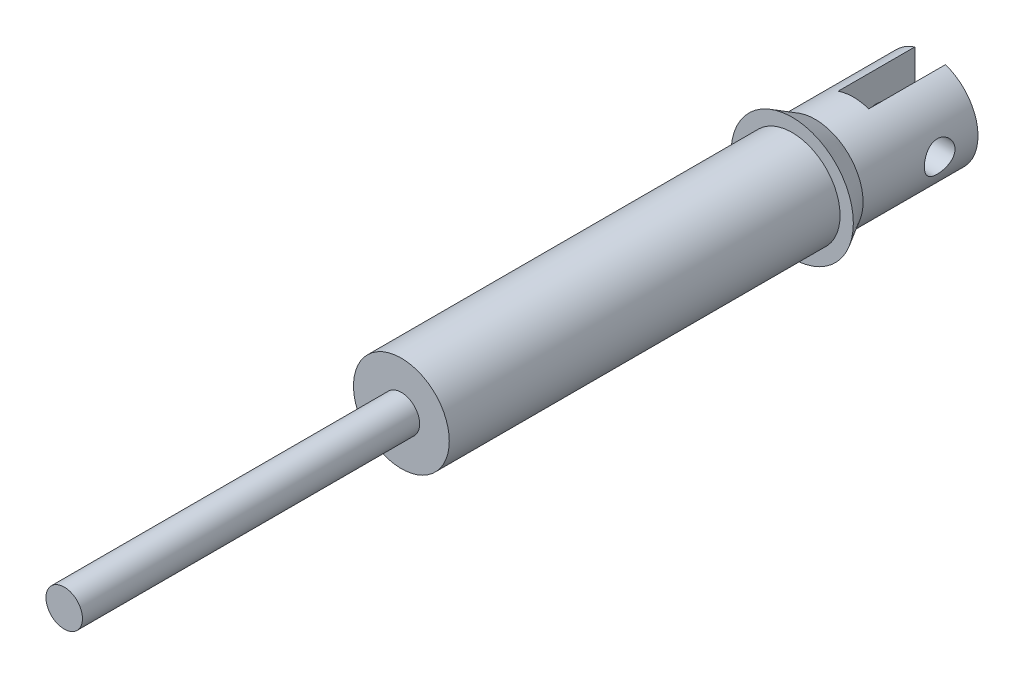
ISO-10303-21;
HEADER;
FILE_DESCRIPTION(('STEP AP214'),'2;1');
FILE_NAME('part.step','',(''),(''),'','','');
FILE_SCHEMA(('AUTOMOTIVE_DESIGN { 1 0 10303 214 1 1 1 1 }'));
ENDSEC;
DATA;
#1=APPLICATION_CONTEXT('core data for automotive mechanical design processes');
#2=APPLICATION_PROTOCOL_DEFINITION('international standard','automotive_design',2000,#1);
#3=PRODUCT_CONTEXT('',#1,'mechanical');
#4=PRODUCT('Part','Part','',(#3));
#5=PRODUCT_RELATED_PRODUCT_CATEGORY('part','',(#4));
#6=PRODUCT_DEFINITION_FORMATION('','',#4);
#7=PRODUCT_DEFINITION_CONTEXT('part definition',#1,'design');
#8=PRODUCT_DEFINITION('design','',#6,#7);
#9=PRODUCT_DEFINITION_SHAPE('','',#8);
#10=(LENGTH_UNIT() NAMED_UNIT(*) SI_UNIT(.MILLI.,.METRE.));
#11=(NAMED_UNIT(*) PLANE_ANGLE_UNIT() SI_UNIT($,.RADIAN.));
#12=(NAMED_UNIT(*) SI_UNIT($,.STERADIAN.) SOLID_ANGLE_UNIT());
#13=UNCERTAINTY_MEASURE_WITH_UNIT(LENGTH_MEASURE(1.E-05),#10,'distance_accuracy_value','');
#14=(GEOMETRIC_REPRESENTATION_CONTEXT(3) GLOBAL_UNCERTAINTY_ASSIGNED_CONTEXT((#13)) GLOBAL_UNIT_ASSIGNED_CONTEXT((#10,
#11,#12)) REPRESENTATION_CONTEXT('',''));
#15=CARTESIAN_POINT('',(0.,0.,0.));
#16=DIRECTION('',(0.,0.,1.));
#17=DIRECTION('',(1.,0.,0.));
#18=AXIS2_PLACEMENT_3D('',#15,#16,#17);
#19=CARTESIAN_POINT('',(0.,0.,0.));
#20=DIRECTION('',(0.,0.,1.));
#21=DIRECTION('',(1.,0.,0.));
#22=AXIS2_PLACEMENT_3D('',#19,#20,#21);
#23=PLANE('',#22);
#24=CARTESIAN_POINT('',(0.,0.,0.));
#25=DIRECTION('',(0.,0.,1.));
#26=DIRECTION('',(1.,0.,0.));
#27=AXIS2_PLACEMENT_3D('',#24,#25,#26);
#28=CIRCLE('',#27,6.25);
#29=CARTESIAN_POINT('',(2.,-5.9213596411635,0.));
#30=VERTEX_POINT('',#29);
#31=CARTESIAN_POINT('',(2.,5.92135964116351,0.));
#32=VERTEX_POINT('',#31);
#33=EDGE_CURVE('E93',#30,#32,#28,.T.);
#34=ORIENTED_EDGE('',*,*,#33,.F.);
#35=DIRECTION('',(0.,1.,0.));
#36=VECTOR('',#35,1.);
#37=CARTESIAN_POINT('',(2.,0.,0.));
#38=LINE('',#37,#36);
#39=EDGE_CURVE('E81',#30,#32,#38,.T.);
#40=ORIENTED_EDGE('',*,*,#39,.T.);
#41=EDGE_LOOP('',(#34,#40));
#42=FACE_BOUND('',#41,.T.);
#43=ADVANCED_FACE('F32',(#42),#23,.F.);
#44=CARTESIAN_POINT('',(0.,0.,69.));
#45=DIRECTION('',(0.,0.,1.));
#46=DIRECTION('',(1.,0.,0.));
#47=AXIS2_PLACEMENT_3D('',#44,#45,#46);
#48=PLANE('',#47);
#49=CARTESIAN_POINT('',(0.,0.,69.));
#50=DIRECTION('',(0.,0.,1.));
#51=DIRECTION('',(1.,0.,0.));
#52=AXIS2_PLACEMENT_3D('',#49,#50,#51);
#53=CIRCLE('',#52,6.25);
#54=CARTESIAN_POINT('',(6.25,0.,69.));
#55=VERTEX_POINT('',#54);
#56=EDGE_CURVE('E119',#55,#55,#53,.T.);
#57=ORIENTED_EDGE('',*,*,#56,.T.);
#58=EDGE_LOOP('',(#57));
#59=FACE_BOUND('',#58,.T.);
#60=CARTESIAN_POINT('',(0.,0.,69.));
#61=DIRECTION('',(0.,0.,1.));
#62=DIRECTION('',(1.,0.,0.));
#63=AXIS2_PLACEMENT_3D('',#60,#61,#62);
#64=CIRCLE('',#63,2.38125);
#65=CARTESIAN_POINT('',(2.38125,0.,69.));
#66=VERTEX_POINT('',#65);
#67=EDGE_CURVE('E112',#66,#66,#64,.T.);
#68=ORIENTED_EDGE('',*,*,#67,.F.);
#69=EDGE_LOOP('',(#68));
#70=FACE_BOUND('',#69,.T.);
#71=ADVANCED_FACE('F141',(#59,#70),#48,.T.);
#72=CARTESIAN_POINT('',(0.,0.,18.));
#73=DIRECTION('',(0.,0.,1.));
#74=DIRECTION('',(1.,0.,0.));
#75=AXIS2_PLACEMENT_3D('',#72,#73,#74);
#76=PLANE('',#75);
#77=CARTESIAN_POINT('',(0.,0.,18.));
#78=DIRECTION('',(0.,0.,1.));
#79=DIRECTION('',(1.,0.,0.));
#80=AXIS2_PLACEMENT_3D('',#77,#78,#79);
#81=CIRCLE('',#80,7.98205080756888);
#82=CARTESIAN_POINT('',(7.98205080756888,0.,18.));
#83=VERTEX_POINT('',#82);
#84=EDGE_CURVE('E97',#83,#83,#81,.T.);
#85=ORIENTED_EDGE('',*,*,#84,.T.);
#86=EDGE_LOOP('',(#85));
#87=FACE_BOUND('',#86,.T.);
#88=CARTESIAN_POINT('',(0.,0.,18.));
#89=DIRECTION('',(0.,0.,1.));
#90=DIRECTION('',(1.,0.,0.));
#91=AXIS2_PLACEMENT_3D('',#88,#89,#90);
#92=CIRCLE('',#91,6.25);
#93=CARTESIAN_POINT('',(6.25,0.,18.));
#94=VERTEX_POINT('',#93);
#95=EDGE_CURVE('E116',#94,#94,#92,.T.);
#96=ORIENTED_EDGE('',*,*,#95,.F.);
#97=EDGE_LOOP('',(#96));
#98=FACE_BOUND('',#97,.T.);
#99=ADVANCED_FACE('F126',(#87,#98),#76,.T.);
#100=CARTESIAN_POINT('',(0.,0.,15.));
#101=DIRECTION('',(0.,0.,-1.));
#102=DIRECTION('',(-1.,0.,0.));
#103=AXIS2_PLACEMENT_3D('',#100,#101,#102);
#104=CYLINDRICAL_SURFACE('',#103,6.25);
#105=CARTESIAN_POINT('',(-6.25,0.,7.));
#106=CARTESIAN_POINT('',(-6.24999973179533,-0.109369757894975,6.99999969543677));
#107=CARTESIAN_POINT('',(-6.24710230195444,-0.218743296323826,6.99099925590093));
#108=CARTESIAN_POINT('',(-6.23582827715283,-0.434283626546853,6.95533522558842));
#109=CARTESIAN_POINT('',(-6.22745068191948,-0.540449829217135,6.92866841022761));
#110=CARTESIAN_POINT('',(-6.20612979544262,-0.746436532239456,6.85866884848529));
#111=CARTESIAN_POINT('',(-6.19319377556489,-0.846266841730744,6.81536263453674));
#112=CARTESIAN_POINT('',(-6.1640862705359,-1.03724845356395,6.71342896239092));
#113=CARTESIAN_POINT('',(-6.14791422875482,-1.12839825878118,6.65479886779299));
#114=CARTESIAN_POINT('',(-6.11346334917281,-1.30236844724373,6.52189485811996));
#115=CARTESIAN_POINT('',(-6.09513697166147,-1.384870115308,6.44721612630822));
#116=CARTESIAN_POINT('',(-6.05871332128838,-1.53641779616535,6.28519616681574));
#117=CARTESIAN_POINT('',(-6.04061609440411,-1.60546114742246,6.19785244043141));
#118=CARTESIAN_POINT('',(-6.00618513498787,-1.72989243842289,6.01018393186202));
#119=CARTESIAN_POINT('',(-5.98990982044271,-1.7848765388743,5.90957964841182));
#120=CARTESIAN_POINT('',(-5.96168322248307,-1.87701146418238,5.69994707028737));
#121=CARTESIAN_POINT('',(-5.9497307371002,-1.91416724716658,5.59092112751462));
#122=CARTESIAN_POINT('',(-5.93200153450746,-1.96841417889152,5.3711467409089));
#123=CARTESIAN_POINT('',(-5.9260426866593,-1.98609871057982,5.26055987280996));
#124=CARTESIAN_POINT('',(-5.9204353880625,-2.00275541323563,5.03784050101943));
#125=CARTESIAN_POINT('',(-5.92078516534133,-2.0017328386715,4.92570844018503));
#126=CARTESIAN_POINT('',(-5.92759523875094,-1.98146725920476,4.7080430188897));
#127=CARTESIAN_POINT('',(-5.93380021788025,-1.96298552665906,4.60242943319412));
#128=CARTESIAN_POINT('',(-5.95120571807702,-1.90956323717674,4.39588894447242));
#129=CARTESIAN_POINT('',(-5.96240679362531,-1.87462085336659,4.2949625630185));
#130=CARTESIAN_POINT('',(-5.9887331770455,-1.78874556448515,4.09887767646782));
#131=CARTESIAN_POINT('',(-6.00391536836703,-1.73757841379653,4.00382972506066));
#132=CARTESIAN_POINT('',(-6.0364680607646,-1.62086867917584,3.82342244621654));
#133=CARTESIAN_POINT('',(-6.05383915268176,-1.55532221033944,3.73806574657058));
#134=CARTESIAN_POINT('',(-6.08982965177339,-1.40800689425483,3.57516915891715));
#135=CARTESIAN_POINT('',(-6.10846901010225,-1.32561170311753,3.49819902882648));
#136=CARTESIAN_POINT('',(-6.14416460143597,-1.14885179027144,3.35902665220794));
#137=CARTESIAN_POINT('',(-6.16122070542134,-1.05448609456587,3.29682560857138));
#138=CARTESIAN_POINT('',(-6.1920223718073,-0.855326975890468,3.18854569589972));
#139=CARTESIAN_POINT('',(-6.20573850684927,-0.750451599300795,3.14260862395446));
#140=CARTESIAN_POINT('',(-6.22810201375246,-0.533919812951414,3.06920050417162));
#141=CARTESIAN_POINT('',(-6.23675100255796,-0.422265578914436,3.0417235652291));
#142=CARTESIAN_POINT('',(-6.24774280298918,-0.200177236986649,3.00699991666848));
#143=CARTESIAN_POINT('',(-6.25032575222693,-0.089875357521343,2.99898240798612));
#144=CARTESIAN_POINT('',(-6.24960819148055,0.130512836985131,3.00122402277663));
#145=CARTESIAN_POINT('',(-6.24630858755258,0.240599182609299,3.01148033163735));
#146=CARTESIAN_POINT('',(-6.23435475396871,0.454418772754765,3.04936264135146));
#147=CARTESIAN_POINT('',(-6.22584358311582,0.558242953097529,3.07652488760738));
#148=CARTESIAN_POINT('',(-6.20446982494186,0.759827068250728,3.14687724924531));
#149=CARTESIAN_POINT('',(-6.19160669299433,0.857586242242656,3.19006937075272));
#150=CARTESIAN_POINT('',(-6.16244413774881,1.04699615483806,3.29246377147269));
#151=CARTESIAN_POINT('',(-6.14606657837613,1.13843202562621,3.35204063992788));
#152=CARTESIAN_POINT('',(-6.111742603006,1.31026437875827,3.48506734123204));
#153=CARTESIAN_POINT('',(-6.09379574290098,1.39065771944248,3.55852110807288));
#154=CARTESIAN_POINT('',(-6.05741209104047,1.54160401860794,3.7208426995137));
#155=CARTESIAN_POINT('',(-6.03898605208419,1.61160724344526,3.8102253346106));
#156=CARTESIAN_POINT('',(-6.00450553887681,1.73567677490712,3.99986834307277));
#157=CARTESIAN_POINT('',(-5.98845104508923,1.78974321282052,4.10012862681756));
#158=CARTESIAN_POINT('',(-5.96070328608219,1.88009475376539,4.3085544733201));
#159=CARTESIAN_POINT('',(-5.94899571025064,1.91643832884307,4.41669266873711));
#160=CARTESIAN_POINT('',(-5.9313910212416,1.97025835307751,4.63800901226291));
#161=CARTESIAN_POINT('',(-5.92549155670917,1.98774243758209,4.75118510141998));
#162=CARTESIAN_POINT('',(-5.9204240987346,2.00278169139458,4.97359496145499));
#163=CARTESIAN_POINT('',(-5.92095023864228,2.00124235557508,5.08276126416124));
#164=CARTESIAN_POINT('',(-5.92792698867181,1.98047943936713,5.29919625679338));
#165=CARTESIAN_POINT('',(-5.9343772966829,1.96125676076401,5.40646504320129));
#166=CARTESIAN_POINT('',(-5.9522567893052,1.90629165520577,5.6143542817211));
#167=CARTESIAN_POINT('',(-5.96360409045953,1.87082034928383,5.71505399861609));
#168=CARTESIAN_POINT('',(-5.98997469492952,1.78458034355478,5.90915220050102));
#169=CARTESIAN_POINT('',(-6.004998771249,1.73380842643282,6.00254914470338));
#170=CARTESIAN_POINT('',(-6.0377936796047,1.6159908338429,6.18351203726801));
#171=CARTESIAN_POINT('',(-6.0556514881585,1.54836635539473,6.27068532841756));
#172=CARTESIAN_POINT('',(-6.09171476059192,1.39976749741106,6.4327396822762));
#173=CARTESIAN_POINT('',(-6.1099203180837,1.31878947708529,6.50761738149831));
#174=CARTESIAN_POINT('',(-6.14538885250146,1.14239026287294,6.64557285740479));
#175=CARTESIAN_POINT('',(-6.16259689850482,1.04656418970098,6.70814868985538));
#176=CARTESIAN_POINT('',(-6.19342234622326,0.845204412408674,6.81622523512153));
#177=CARTESIAN_POINT('',(-6.20704098839117,0.739674079010199,6.86173184915099));
#178=CARTESIAN_POINT('',(-6.22835426330082,0.529579289556059,6.93155972478805));
#179=CARTESIAN_POINT('',(-6.23639876626813,0.425470958109165,6.95714806322889));
#180=CARTESIAN_POINT('',(-6.24722116926742,0.21424250134515,6.99136642863002));
#181=CARTESIAN_POINT('',(-6.25000026269516,0.107123064076744,7.00000029830684));
#182=CARTESIAN_POINT('',(-6.25,0.,7.));
#183=B_SPLINE_CURVE_WITH_KNOTS('',3,(#105,#106,#107,#108,#109,#110,#111,#112,#113,#114,#115,
#116,#117,#118,#119,#120,#121,#122,#123,#124,#125,#126,#127,#128,#129,#130,#131,#132,#133,#134,
#135,#136,#137,#138,#139,#140,#141,#142,#143,#144,#145,#146,#147,#148,#149,#150,#151,#152,#153,
#154,#155,#156,#157,#158,#159,#160,#161,#162,#163,#164,#165,#166,#167,#168,#169,#170,#171,#172,
#173,#174,#175,#176,#177,#178,#179,#180,#181,#182),.UNSPECIFIED.,.T.,.F.,(4,2,2,2,2,2,2,2,2,2,2,
2,2,2,2,2,2,2,2,2,2,2,2,2,2,2,2,2,2,2,2,2,2,2,2,2,2,2,4),(0.,0.327715362333109,
0.655490557935455,0.98274525263964,1.31005628705879,1.64687147689459,1.98375320835532,
2.32943536033283,2.67502132089943,3.00975612499383,3.34439690992779,3.66508861689307,
3.98581592398473,4.31140244918454,4.63707704766261,4.97834106010779,5.31963285780694,
5.66383089167743,6.00791903082936,6.3381376323918,6.66830537665873,6.98979270484736,
7.31132028047916,7.64091693818852,7.97060717456023,8.31403741316325,8.65746482247428,
8.99975138343881,9.34189931610995,9.66782668716059,9.99373743803735,10.3143977860164,
10.6351256075088,10.968921958449,11.3028094685698,11.6483285691407,11.9937281056216,
12.3147842538168,12.6357676264952),.UNSPECIFIED.);
#184=CARTESIAN_POINT('',(-6.25,0.,7.));
#185=VERTEX_POINT('',#184);
#186=EDGE_CURVE('E186',#185,#185,#183,.T.);
#187=ORIENTED_EDGE('',*,*,#186,.T.);
#188=EDGE_LOOP('',(#187));
#189=FACE_BOUND('',#188,.T.);
#190=CARTESIAN_POINT('',(5.92135964116351,-2.,5.));
#191=CARTESIAN_POINT('',(5.92135998476186,-1.99999967967343,5.10920779747864));
#192=CARTESIAN_POINT('',(5.92441386991634,-1.99102491458079,5.21841937969112));
#193=CARTESIAN_POINT('',(5.93624214878925,-1.95547211465634,5.43362448452729));
#194=CARTESIAN_POINT('',(5.94501786966859,-1.9288899958342,5.53961725458734));
#195=CARTESIAN_POINT('',(5.96719626827031,-1.8591377735317,5.74523512705041));
#196=CARTESIAN_POINT('',(5.98059044592124,-1.81599812708639,5.84487153162743));
#197=CARTESIAN_POINT('',(6.01048456937789,-1.7144579306801,6.03552205127768));
#198=CARTESIAN_POINT('',(6.02698511340943,-1.65605444035677,6.12653450046089));
#199=CARTESIAN_POINT('',(6.06189960955843,-1.52339052441434,6.30063299391462));
#200=CARTESIAN_POINT('',(6.08035847538155,-1.44867418411649,6.38336270684343));
#201=CARTESIAN_POINT('',(6.11672850267086,-1.28648015291272,6.53535803232987));
#202=CARTESIAN_POINT('',(6.13463958340611,-1.19900059185914,6.60462166827774));
#203=CARTESIAN_POINT('',(6.16841191356945,-1.01118677807846,6.72930673162499));
#204=CARTESIAN_POINT('',(6.18421413930889,-0.910595859826241,6.78435893663657));
#205=CARTESIAN_POINT('',(6.21146213306834,-0.700990241885686,6.87662320495704));
#206=CARTESIAN_POINT('',(6.22290897758066,-0.591977631758358,6.91383967720335));
#207=CARTESIAN_POINT('',(6.23983847518951,-0.372355887648846,6.96817972403544));
#208=CARTESIAN_POINT('',(6.24550163742727,-0.26191173609274,6.98591282207701));
#209=CARTESIAN_POINT('',(6.2508643514924,-0.0394801624006164,7.00271638187638));
#210=CARTESIAN_POINT('',(6.25056532287035,0.0725068860385584,7.00179128600224));
#211=CARTESIAN_POINT('',(6.24416184989488,0.290546864583697,6.98170062253454));
#212=CARTESIAN_POINT('',(6.23826785172455,0.396667895379409,6.96319625269922));
#213=CARTESIAN_POINT('',(6.2215974246691,0.604210367062037,6.90956022094857));
#214=CARTESIAN_POINT('',(6.21082067245857,0.70563149624132,6.87442745793009));
#215=CARTESIAN_POINT('',(6.18531827502582,0.902392437018607,6.78812095935272));
#216=CARTESIAN_POINT('',(6.17054466663056,0.997639714841873,6.73675102300805));
#217=CARTESIAN_POINT('',(6.1385985427555,1.17836429676392,6.61958724137681));
#218=CARTESIAN_POINT('',(6.1214253989639,1.26383903125564,6.55378961566172));
#219=CARTESIAN_POINT('',(6.0856183647614,1.42653190655439,6.40626544783352));
#220=CARTESIAN_POINT('',(6.06695343103239,1.50322767225175,6.3239695461781));
#221=CARTESIAN_POINT('',(6.03090729940113,1.64189009197574,6.1475146737755));
#222=CARTESIAN_POINT('',(6.01352626860905,1.70385483096239,6.0533541630557));
#223=CARTESIAN_POINT('',(5.98185446725777,1.81194405478173,5.85430407463341));
#224=CARTESIAN_POINT('',(5.96760407300834,1.85786563049295,5.74929740578095));
#225=CARTESIAN_POINT('',(5.94427814360831,1.93120577191018,5.5324739920097));
#226=CARTESIAN_POINT('',(5.93520064149954,1.9586313713181,5.42065985351101));
#227=CARTESIAN_POINT('',(5.9236878971964,1.99317366489087,5.19842011238684));
#228=CARTESIAN_POINT('',(5.92099005442854,2.0010938469277,5.08813293959429));
#229=CARTESIAN_POINT('',(5.92181123472216,1.99866334883918,4.86779466182657));
#230=CARTESIAN_POINT('',(5.92532923924007,1.98831566213062,4.75774352113313));
#231=CARTESIAN_POINT('',(5.937925551788,1.95036266680891,4.54452871582041));
#232=CARTESIAN_POINT('',(5.94682930616132,1.92329858214221,4.44125731662673));
#233=CARTESIAN_POINT('',(5.96900643852271,1.85332140362576,4.24073605032485));
#234=CARTESIAN_POINT('',(5.98228055164545,1.8104056432298,4.14348719953682));
#235=CARTESIAN_POINT('',(6.01219302958116,1.70848698006287,3.95456519104781));
#236=CARTESIAN_POINT('',(6.02891980493212,1.64904308694586,3.86314430148838));
#237=CARTESIAN_POINT('',(6.06367399166066,1.516264997066,3.69128322227025));
#238=CARTESIAN_POINT('',(6.08170175631887,1.44292701854318,3.61084603248961));
#239=CARTESIAN_POINT('',(6.11798140653486,1.28062622256147,3.45960111170725));
#240=CARTESIAN_POINT('',(6.13620856133577,1.19111998936255,3.38936899802035));
#241=CARTESIAN_POINT('',(6.17004831911523,1.00114860610783,3.2648936534041));
#242=CARTESIAN_POINT('',(6.18566103370672,0.900683924181145,3.21064973984815));
#243=CARTESIAN_POINT('',(6.21242861452459,0.692229701130324,3.12020500341536));
#244=CARTESIAN_POINT('',(6.2236147017608,0.584299406945835,3.08387735198278));
#245=CARTESIAN_POINT('',(6.2404053082885,0.363437478531501,3.03001986986158));
#246=CARTESIAN_POINT('',(6.24601166798435,0.250507506229132,3.01248384084137));
#247=CARTESIAN_POINT('',(6.2508831564913,0.0281382939531291,2.99723036512531));
#248=CARTESIAN_POINT('',(6.25041372386223,-0.0812388806180512,2.99868335621263));
#249=CARTESIAN_POINT('',(6.24382844496373,-0.29811929738785,3.01934635597279));
#250=CARTESIAN_POINT('',(6.23771299772853,-0.405622671470961,3.03855510975045));
#251=CARTESIAN_POINT('',(6.22061167697183,-0.614253801990323,3.09364783845745));
#252=CARTESIAN_POINT('',(6.20969346874306,-0.715448585716457,3.12930046555709));
#253=CARTESIAN_POINT('',(6.18411154965363,-0.910465671380204,3.21605826196533));
#254=CARTESIAN_POINT('',(6.16944718235183,-1.00428667743578,3.26716613979321));
#255=CARTESIAN_POINT('',(6.13725692746991,-1.18547232081835,3.38545138473183));
#256=CARTESIAN_POINT('',(6.11964878172834,-1.27249556591595,3.45312904525579));
#257=CARTESIAN_POINT('',(6.08377979990128,-1.43422400975324,3.60176159480018));
#258=CARTESIAN_POINT('',(6.06551876529022,-1.50892542232855,3.68272054961658));
#259=CARTESIAN_POINT('',(6.02964415622516,-1.64655245654914,3.85903330704627));
#260=CARTESIAN_POINT('',(6.01207605539073,-1.70897051122908,3.95479375259335));
#261=CARTESIAN_POINT('',(5.98038709777068,-1.81676735852476,4.15598088208709));
#262=CARTESIAN_POINT('',(5.96626501637083,-1.86215220733617,4.26140411378828));
#263=CARTESIAN_POINT('',(5.94407335384122,-1.93177007983226,4.47122855139355));
#264=CARTESIAN_POINT('',(5.93564467321732,-1.9572781382433,4.57516894489571));
#265=CARTESIAN_POINT('',(5.9242884143786,-1.99139090218281,4.78607224856542));
#266=CARTESIAN_POINT('',(5.92135930461945,-2.00000031375007,4.89303430882116));
#267=CARTESIAN_POINT('',(5.92135964116351,-2.,5.));
#268=B_SPLINE_CURVE_WITH_KNOTS('',3,(#190,#191,#192,#193,#194,#195,#196,#197,#198,#199,#200,
#201,#202,#203,#204,#205,#206,#207,#208,#209,#210,#211,#212,#213,#214,#215,#216,#217,#218,#219,
#220,#221,#222,#223,#224,#225,#226,#227,#228,#229,#230,#231,#232,#233,#234,#235,#236,#237,#238,
#239,#240,#241,#242,#243,#244,#245,#246,#247,#248,#249,#250,#251,#252,#253,#254,#255,#256,#257,
#258,#259,#260,#261,#262,#263,#264,#265,#266,#267),.UNSPECIFIED.,.T.,.F.,(4,2,2,2,2,2,2,2,2,2,2,
2,2,2,2,2,2,2,2,2,2,2,2,2,2,2,2,2,2,2,2,2,2,2,2,2,2,2,4),(0.,0.327227921357677,
0.654531769165501,0.981236415491744,1.3080040432669,1.64545271521208,1.98295088201676,
2.3284922186384,2.67394809440606,3.00825843024463,3.34248917038246,3.66462659253522,
3.9867853490501,4.31299612594807,4.6392924808827,4.97981335405321,5.32037847090972,
5.66510702272208,6.00970440615796,6.33984989165665,6.66994128374528,6.98986820430155,
7.30984896703495,7.63935816615262,7.96895718188148,8.31298340485801,8.65699493728243,
8.99853496107642,9.33996229473067,9.66652566025143,9.99306594754841,10.3151460734629,
10.6372826763822,10.9707061421475,11.3042318697985,11.649507512625,11.9946602753352,
12.315259292124,12.6357690138577),.UNSPECIFIED.);
#269=CARTESIAN_POINT('',(5.92135964116351,-2.,5.));
#270=VERTEX_POINT('',#269);
#271=EDGE_CURVE('E181',#270,#270,#268,.T.);
#272=ORIENTED_EDGE('',*,*,#271,.T.);
#273=EDGE_LOOP('',(#272));
#274=FACE_BOUND('',#273,.T.);
#275=ORIENTED_EDGE('',*,*,#33,.T.);
#276=DIRECTION('',(0.,0.,-1.));
#277=VECTOR('',#276,1.);
#278=CARTESIAN_POINT('',(2.,5.92135964116351,15.));
#279=LINE('',#278,#277);
#280=CARTESIAN_POINT('',(2.,5.92135964116351,10.));
#281=VERTEX_POINT('',#280);
#282=EDGE_CURVE('E90',#32,#281,#279,.F.);
#283=ORIENTED_EDGE('',*,*,#282,.T.);
#284=CARTESIAN_POINT('',(0.,0.,10.));
#285=DIRECTION('',(0.,0.,-1.));
#286=DIRECTION('',(-1.,0.,0.));
#287=AXIS2_PLACEMENT_3D('',#284,#285,#286);
#288=CIRCLE('',#287,6.25);
#289=CARTESIAN_POINT('',(-2.,5.92135964116351,10.));
#290=VERTEX_POINT('',#289);
#291=EDGE_CURVE('E11',#290,#281,#288,.T.);
#292=ORIENTED_EDGE('',*,*,#291,.F.);
#293=DIRECTION('',(0.,0.,-1.));
#294=VECTOR('',#293,1.);
#295=CARTESIAN_POINT('',(-2.,5.92135964116351,15.));
#296=LINE('',#295,#294);
#297=CARTESIAN_POINT('',(-2.,5.92135964116351,0.));
#298=VERTEX_POINT('',#297);
#299=EDGE_CURVE('E76',#290,#298,#296,.T.);
#300=ORIENTED_EDGE('',*,*,#299,.T.);
#301=CARTESIAN_POINT('',(-2.,-5.92135964116351,0.));
#302=VERTEX_POINT('',#301);
#303=EDGE_CURVE('E88',#298,#302,#28,.T.);
#304=ORIENTED_EDGE('',*,*,#303,.T.);
#305=DIRECTION('',(0.,0.,-1.));
#306=VECTOR('',#305,1.);
#307=CARTESIAN_POINT('',(-2.,-5.92135964116351,15.));
#308=LINE('',#307,#306);
#309=CARTESIAN_POINT('',(-2.,-5.92135964116351,10.));
#310=VERTEX_POINT('',#309);
#311=EDGE_CURVE('E49',#302,#310,#308,.F.);
#312=ORIENTED_EDGE('',*,*,#311,.T.);
#313=CARTESIAN_POINT('',(2.,-5.92135964116351,10.));
#314=VERTEX_POINT('',#313);
#315=EDGE_CURVE('E42',#314,#310,#288,.T.);
#316=ORIENTED_EDGE('',*,*,#315,.F.);
#317=DIRECTION('',(0.,0.,-1.));
#318=VECTOR('',#317,1.);
#319=CARTESIAN_POINT('',(2.,-5.92135964116351,15.));
#320=LINE('',#319,#318);
#321=EDGE_CURVE('E57',#314,#30,#320,.T.);
#322=ORIENTED_EDGE('',*,*,#321,.T.);
#323=EDGE_LOOP('',(#275,#283,#292,#300,#304,#312,#316,#322));
#324=FACE_BOUND('',#323,.T.);
#325=CARTESIAN_POINT('',(0.,0.,15.));
#326=DIRECTION('',(0.,0.,1.));
#327=DIRECTION('',(1.,0.,0.));
#328=AXIS2_PLACEMENT_3D('',#325,#326,#327);
#329=CIRCLE('',#328,6.25);
#330=CARTESIAN_POINT('',(6.25,0.,15.));
#331=VERTEX_POINT('',#330);
#332=EDGE_CURVE('E82',#331,#331,#329,.T.);
#333=ORIENTED_EDGE('',*,*,#332,.F.);
#334=EDGE_LOOP('',(#333));
#335=FACE_BOUND('',#334,.T.);
#336=ADVANCED_FACE('F34',(#189,#274,#324,#335),#104,.T.);
#337=ORIENTED_EDGE('',*,*,#303,.F.);
#338=DIRECTION('',(0.,-1.,0.));
#339=VECTOR('',#338,1.);
#340=CARTESIAN_POINT('',(-2.,0.,0.));
#341=LINE('',#340,#339);
#342=EDGE_CURVE('E73',#298,#302,#341,.T.);
#343=ORIENTED_EDGE('',*,*,#342,.T.);
#344=EDGE_LOOP('',(#337,#343));
#345=FACE_BOUND('',#344,.T.);
#346=ADVANCED_FACE('F92',(#345),#23,.F.);
#347=CARTESIAN_POINT('',(0.,0.,15.));
#348=DIRECTION('',(0.,0.,1.));
#349=DIRECTION('',(1.,0.,0.));
#350=AXIS2_PLACEMENT_3D('',#347,#348,#349);
#351=CONICAL_SURFACE('',#350,6.25,0.5235987755983);
#352=ORIENTED_EDGE('',*,*,#84,.F.);
#353=EDGE_LOOP('',(#352));
#354=FACE_BOUND('',#353,.T.);
#355=ORIENTED_EDGE('',*,*,#332,.T.);
#356=EDGE_LOOP('',(#355));
#357=FACE_BOUND('',#356,.T.);
#358=ADVANCED_FACE('F129',(#354,#357),#351,.T.);
#359=CARTESIAN_POINT('',(0.,0.,69.));
#360=DIRECTION('',(0.,0.,-1.));
#361=DIRECTION('',(-1.,0.,0.));
#362=AXIS2_PLACEMENT_3D('',#359,#360,#361);
#363=CYLINDRICAL_SURFACE('',#362,6.25);
#364=ORIENTED_EDGE('',*,*,#56,.F.);
#365=EDGE_LOOP('',(#364));
#366=FACE_BOUND('',#365,.T.);
#367=ORIENTED_EDGE('',*,*,#95,.T.);
#368=EDGE_LOOP('',(#367));
#369=FACE_BOUND('',#368,.T.);
#370=ADVANCED_FACE('F132',(#366,#369),#363,.T.);
#371=CARTESIAN_POINT('',(0.,0.,113.));
#372=DIRECTION('',(0.,0.,-1.));
#373=DIRECTION('',(-1.,0.,0.));
#374=AXIS2_PLACEMENT_3D('',#371,#372,#373);
#375=CYLINDRICAL_SURFACE('',#374,2.38125);
#376=CARTESIAN_POINT('',(0.,0.,113.));
#377=DIRECTION('',(0.,0.,1.));
#378=DIRECTION('',(1.,0.,0.));
#379=AXIS2_PLACEMENT_3D('',#376,#377,#378);
#380=CIRCLE('',#379,2.38125);
#381=CARTESIAN_POINT('',(2.38125,0.,113.));
#382=VERTEX_POINT('',#381);
#383=EDGE_CURVE('E113',#382,#382,#380,.T.);
#384=ORIENTED_EDGE('',*,*,#383,.F.);
#385=EDGE_LOOP('',(#384));
#386=FACE_BOUND('',#385,.T.);
#387=ORIENTED_EDGE('',*,*,#67,.T.);
#388=EDGE_LOOP('',(#387));
#389=FACE_BOUND('',#388,.T.);
#390=ADVANCED_FACE('F155',(#386,#389),#375,.T.);
#391=CARTESIAN_POINT('',(0.,0.,113.));
#392=DIRECTION('',(0.,0.,1.));
#393=DIRECTION('',(1.,0.,0.));
#394=AXIS2_PLACEMENT_3D('',#391,#392,#393);
#395=PLANE('',#394);
#396=ORIENTED_EDGE('',*,*,#383,.T.);
#397=EDGE_LOOP('',(#396));
#398=FACE_BOUND('',#397,.T.);
#399=ADVANCED_FACE('F160',(#398),#395,.T.);
#400=CARTESIAN_POINT('',(2.,-7.13712938908753,10.));
#401=DIRECTION('',(0.,0.,-1.));
#402=DIRECTION('',(-1.,0.,0.));
#403=AXIS2_PLACEMENT_3D('',#400,#401,#402);
#404=PLANE('',#403);
#405=ORIENTED_EDGE('',*,*,#291,.T.);
#406=DIRECTION('',(0.,-1.,0.));
#407=VECTOR('',#406,1.);
#408=CARTESIAN_POINT('',(2.,7.80392002405501,10.));
#409=LINE('',#408,#407);
#410=EDGE_CURVE('E105',#281,#314,#409,.T.);
#411=ORIENTED_EDGE('',*,*,#410,.T.);
#412=ORIENTED_EDGE('',*,*,#315,.T.);
#413=DIRECTION('',(0.,1.,0.));
#414=VECTOR('',#413,1.);
#415=CARTESIAN_POINT('',(-2.,7.80392002405501,10.));
#416=LINE('',#415,#414);
#417=EDGE_CURVE('E104',#310,#290,#416,.T.);
#418=ORIENTED_EDGE('',*,*,#417,.T.);
#419=EDGE_LOOP('',(#405,#411,#412,#418));
#420=FACE_BOUND('',#419,.T.);
#421=ADVANCED_FACE('F103',(#420),#404,.T.);
#422=CARTESIAN_POINT('',(2.,7.80392002405501,10.));
#423=DIRECTION('',(1.,0.,0.));
#424=DIRECTION('',(0.,1.,0.));
#425=AXIS2_PLACEMENT_3D('',#422,#423,#424);
#426=PLANE('',#425);
#427=CARTESIAN_POINT('',(2.,0.,5.));
#428=DIRECTION('',(1.,0.,0.));
#429=DIRECTION('',(0.,1.,0.));
#430=AXIS2_PLACEMENT_3D('',#427,#428,#429);
#431=CIRCLE('',#430,2.);
#432=CARTESIAN_POINT('',(2.,2.,5.));
#433=VERTEX_POINT('',#432);
#434=EDGE_CURVE('E191',#433,#433,#431,.T.);
#435=ORIENTED_EDGE('',*,*,#434,.T.);
#436=EDGE_LOOP('',(#435));
#437=FACE_BOUND('',#436,.T.);
#438=ORIENTED_EDGE('',*,*,#410,.F.);
#439=ORIENTED_EDGE('',*,*,#282,.F.);
#440=ORIENTED_EDGE('',*,*,#39,.F.);
#441=ORIENTED_EDGE('',*,*,#321,.F.);
#442=EDGE_LOOP('',(#438,#439,#440,#441));
#443=FACE_BOUND('',#442,.T.);
#444=ADVANCED_FACE('F165',(#437,#443),#426,.F.);
#445=CARTESIAN_POINT('',(-2.,7.80392002405501,10.));
#446=DIRECTION('',(-1.,0.,0.));
#447=DIRECTION('',(0.,-1.,0.));
#448=AXIS2_PLACEMENT_3D('',#445,#446,#447);
#449=PLANE('',#448);
#450=CARTESIAN_POINT('',(-2.,0.,5.));
#451=DIRECTION('',(-1.,0.,0.));
#452=DIRECTION('',(0.,-1.,0.));
#453=AXIS2_PLACEMENT_3D('',#450,#451,#452);
#454=CIRCLE('',#453,2.);
#455=CARTESIAN_POINT('',(-2.,-2.,5.));
#456=VERTEX_POINT('',#455);
#457=EDGE_CURVE('E37',#456,#456,#454,.T.);
#458=ORIENTED_EDGE('',*,*,#457,.T.);
#459=EDGE_LOOP('',(#458));
#460=FACE_BOUND('',#459,.T.);
#461=ORIENTED_EDGE('',*,*,#417,.F.);
#462=ORIENTED_EDGE('',*,*,#311,.F.);
#463=ORIENTED_EDGE('',*,*,#342,.F.);
#464=ORIENTED_EDGE('',*,*,#299,.F.);
#465=EDGE_LOOP('',(#461,#462,#463,#464));
#466=FACE_BOUND('',#465,.T.);
#467=ADVANCED_FACE('F75',(#460,#466),#449,.F.);
#468=CARTESIAN_POINT('',(7.98205080756888,0.,5.));
#469=DIRECTION('',(-1.,0.,0.));
#470=DIRECTION('',(0.,-1.,0.));
#471=AXIS2_PLACEMENT_3D('',#468,#469,#470);
#472=CYLINDRICAL_SURFACE('',#471,2.);
#473=ORIENTED_EDGE('',*,*,#457,.F.);
#474=EDGE_LOOP('',(#473));
#475=FACE_BOUND('',#474,.T.);
#476=ORIENTED_EDGE('',*,*,#186,.F.);
#477=EDGE_LOOP('',(#476));
#478=FACE_BOUND('',#477,.T.);
#479=ADVANCED_FACE('F171',(#475,#478),#472,.F.);
#480=ORIENTED_EDGE('',*,*,#434,.F.);
#481=EDGE_LOOP('',(#480));
#482=FACE_BOUND('',#481,.T.);
#483=ORIENTED_EDGE('',*,*,#271,.F.);
#484=EDGE_LOOP('',(#483));
#485=FACE_BOUND('',#484,.T.);
#486=ADVANCED_FACE('F177',(#482,#485),#472,.F.);
#487=CLOSED_SHELL('',(#43,#71,#99,#336,#346,#358,#370,#390,#399,#421,#444,#467,#479,#486));
#488=MANIFOLD_SOLID_BREP('B2',#487);
#489=ADVANCED_BREP_SHAPE_REPRESENTATION('',(#18,#488),#14);
#490=SHAPE_DEFINITION_REPRESENTATION(#9,#489);
ENDSEC;
END-ISO-10303-21;
